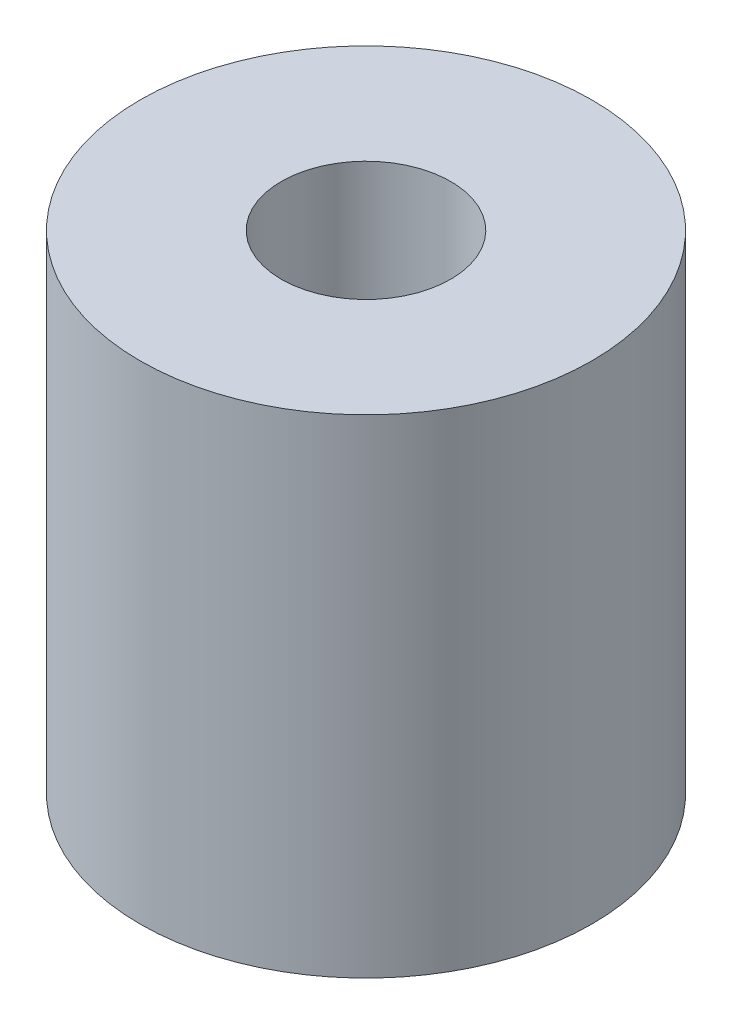
ISO-10303-21;
HEADER;
FILE_DESCRIPTION(('STEP AP214'),'2;1');
FILE_NAME('part.step','',(''),(''),'','','');
FILE_SCHEMA(('AUTOMOTIVE_DESIGN { 1 0 10303 214 1 1 1 1 }'));
ENDSEC;
DATA;
#1=APPLICATION_CONTEXT('core data for automotive mechanical design processes');
#2=APPLICATION_PROTOCOL_DEFINITION('international standard','automotive_design',2000,#1);
#3=PRODUCT_CONTEXT('',#1,'mechanical');
#4=PRODUCT('Part','Part','',(#3));
#5=PRODUCT_RELATED_PRODUCT_CATEGORY('part','',(#4));
#6=PRODUCT_DEFINITION_FORMATION('','',#4);
#7=PRODUCT_DEFINITION_CONTEXT('part definition',#1,'design');
#8=PRODUCT_DEFINITION('design','',#6,#7);
#9=PRODUCT_DEFINITION_SHAPE('','',#8);
#10=(LENGTH_UNIT() NAMED_UNIT(*) SI_UNIT(.MILLI.,.METRE.));
#11=(NAMED_UNIT(*) PLANE_ANGLE_UNIT() SI_UNIT($,.RADIAN.));
#12=(NAMED_UNIT(*) SI_UNIT($,.STERADIAN.) SOLID_ANGLE_UNIT());
#13=UNCERTAINTY_MEASURE_WITH_UNIT(LENGTH_MEASURE(1.E-05),#10,'distance_accuracy_value','');
#14=(GEOMETRIC_REPRESENTATION_CONTEXT(3) GLOBAL_UNCERTAINTY_ASSIGNED_CONTEXT((#13)) GLOBAL_UNIT_ASSIGNED_CONTEXT((#10,
#11,#12)) REPRESENTATION_CONTEXT('',''));
#15=CARTESIAN_POINT('',(0.,0.,0.));
#16=DIRECTION('',(0.,0.,1.));
#17=DIRECTION('',(1.,0.,0.));
#18=AXIS2_PLACEMENT_3D('',#15,#16,#17);
#19=CARTESIAN_POINT('',(0.,8.636,0.));
#20=DIRECTION('',(0.,-1.,0.));
#21=DIRECTION('',(0.,0.,-1.));
#22=AXIS2_PLACEMENT_3D('',#19,#20,#21);
#23=CYLINDRICAL_SURFACE('',#22,4.0000047);
#24=CARTESIAN_POINT('',(0.,8.636,0.));
#25=DIRECTION('',(0.,1.,0.));
#26=DIRECTION('',(0.,0.,1.));
#27=AXIS2_PLACEMENT_3D('',#24,#25,#26);
#28=CIRCLE('',#27,4.0000047);
#29=CARTESIAN_POINT('',(0.,8.636,4.0000047));
#30=VERTEX_POINT('',#29);
#31=EDGE_CURVE('E10',#30,#30,#28,.T.);
#32=ORIENTED_EDGE('',*,*,#31,.F.);
#33=EDGE_LOOP('',(#32));
#34=FACE_BOUND('',#33,.T.);
#35=CARTESIAN_POINT('',(0.,0.,0.));
#36=DIRECTION('',(0.,1.,0.));
#37=DIRECTION('',(0.,0.,1.));
#38=AXIS2_PLACEMENT_3D('',#35,#36,#37);
#39=CIRCLE('',#38,4.0000047);
#40=CARTESIAN_POINT('',(0.,0.,4.0000047));
#41=VERTEX_POINT('',#40);
#42=EDGE_CURVE('E34',#41,#41,#39,.T.);
#43=ORIENTED_EDGE('',*,*,#42,.T.);
#44=EDGE_LOOP('',(#43));
#45=FACE_BOUND('',#44,.T.);
#46=ADVANCED_FACE('F31',(#34,#45),#23,.T.);
#47=CARTESIAN_POINT('',(0.,8.636,0.));
#48=DIRECTION('',(0.,1.,0.));
#49=DIRECTION('',(0.,0.,1.));
#50=AXIS2_PLACEMENT_3D('',#47,#48,#49);
#51=PLANE('',#50);
#52=CARTESIAN_POINT('',(0.,8.636,0.));
#53=DIRECTION('',(0.,1.,0.));
#54=DIRECTION('',(0.,0.,1.));
#55=AXIS2_PLACEMENT_3D('',#52,#53,#54);
#56=CIRCLE('',#55,1.5);
#57=CARTESIAN_POINT('',(0.,8.636,1.5));
#58=VERTEX_POINT('',#57);
#59=EDGE_CURVE('E43',#58,#58,#56,.T.);
#60=ORIENTED_EDGE('',*,*,#59,.F.);
#61=EDGE_LOOP('',(#60));
#62=FACE_BOUND('',#61,.T.);
#63=ORIENTED_EDGE('',*,*,#31,.T.);
#64=EDGE_LOOP('',(#63));
#65=FACE_BOUND('',#64,.T.);
#66=ADVANCED_FACE('F58',(#62,#65),#51,.T.);
#67=CARTESIAN_POINT('',(0.,0.,0.));
#68=DIRECTION('',(0.,1.,0.));
#69=DIRECTION('',(0.,0.,1.));
#70=AXIS2_PLACEMENT_3D('',#67,#68,#69);
#71=PLANE('',#70);
#72=ORIENTED_EDGE('',*,*,#42,.F.);
#73=EDGE_LOOP('',(#72));
#74=FACE_BOUND('',#73,.T.);
#75=ADVANCED_FACE('F54',(#74),#71,.F.);
#76=CARTESIAN_POINT('',(0.,1.016,0.));
#77=DIRECTION('',(0.,1.,0.));
#78=DIRECTION('',(0.,0.,1.));
#79=AXIS2_PLACEMENT_3D('',#76,#77,#78);
#80=CYLINDRICAL_SURFACE('',#79,1.5);
#81=CARTESIAN_POINT('',(0.,1.016,0.));
#82=DIRECTION('',(0.,1.,0.));
#83=DIRECTION('',(0.,0.,1.));
#84=AXIS2_PLACEMENT_3D('',#81,#82,#83);
#85=CIRCLE('',#84,1.5);
#86=CARTESIAN_POINT('',(0.,1.016,1.5));
#87=VERTEX_POINT('',#86);
#88=EDGE_CURVE('E41',#87,#87,#85,.T.);
#89=CARTESIAN_POINT('',(0.,1.016,1.5));
#90=CARTESIAN_POINT('',(0.,1.095375,1.5));
#91=CARTESIAN_POINT('',(0.,1.17475,1.5));
#92=CARTESIAN_POINT('',(0.,1.3335,1.5));
#93=CARTESIAN_POINT('',(0.,1.412875,1.5));
#94=CARTESIAN_POINT('',(0.,1.571625,1.5));
#95=CARTESIAN_POINT('',(0.,1.651,1.5));
#96=CARTESIAN_POINT('',(0.,1.80975,1.5));
#97=CARTESIAN_POINT('',(0.,1.889125,1.5));
#98=CARTESIAN_POINT('',(0.,2.047875,1.5));
#99=CARTESIAN_POINT('',(0.,2.12725,1.5));
#100=CARTESIAN_POINT('',(0.,2.286,1.5));
#101=CARTESIAN_POINT('',(0.,2.365375,1.5));
#102=CARTESIAN_POINT('',(0.,2.524125,1.5));
#103=CARTESIAN_POINT('',(0.,2.6035,1.5));
#104=CARTESIAN_POINT('',(0.,2.76225,1.5));
#105=CARTESIAN_POINT('',(0.,2.841625,1.5));
#106=CARTESIAN_POINT('',(0.,3.000375,1.5));
#107=CARTESIAN_POINT('',(0.,3.07975,1.5));
#108=CARTESIAN_POINT('',(0.,3.2385,1.5));
#109=CARTESIAN_POINT('',(0.,3.317875,1.5));
#110=CARTESIAN_POINT('',(0.,3.476625,1.5));
#111=CARTESIAN_POINT('',(0.,3.556,1.5));
#112=CARTESIAN_POINT('',(0.,3.71475,1.5));
#113=CARTESIAN_POINT('',(0.,3.794125,1.5));
#114=CARTESIAN_POINT('',(0.,3.952875,1.5));
#115=CARTESIAN_POINT('',(0.,4.03225,1.5));
#116=CARTESIAN_POINT('',(0.,4.191,1.5));
#117=CARTESIAN_POINT('',(0.,4.270375,1.5));
#118=CARTESIAN_POINT('',(0.,4.429125,1.5));
#119=CARTESIAN_POINT('',(0.,4.5085,1.5));
#120=CARTESIAN_POINT('',(0.,4.66725,1.5));
#121=CARTESIAN_POINT('',(0.,4.746625,1.5));
#122=CARTESIAN_POINT('',(0.,4.905375,1.5));
#123=CARTESIAN_POINT('',(0.,4.98475,1.5));
#124=CARTESIAN_POINT('',(0.,5.1435,1.5));
#125=CARTESIAN_POINT('',(0.,5.222875,1.5));
#126=CARTESIAN_POINT('',(0.,5.381625,1.5));
#127=CARTESIAN_POINT('',(0.,5.461,1.5));
#128=CARTESIAN_POINT('',(0.,5.61975,1.5));
#129=CARTESIAN_POINT('',(0.,5.699125,1.5));
#130=CARTESIAN_POINT('',(0.,5.857875,1.5));
#131=CARTESIAN_POINT('',(0.,5.93725,1.5));
#132=CARTESIAN_POINT('',(0.,6.096,1.5));
#133=CARTESIAN_POINT('',(0.,6.175375,1.5));
#134=CARTESIAN_POINT('',(0.,6.334125,1.5));
#135=CARTESIAN_POINT('',(0.,6.4135,1.5));
#136=CARTESIAN_POINT('',(0.,6.57225,1.5));
#137=CARTESIAN_POINT('',(0.,6.651625,1.5));
#138=CARTESIAN_POINT('',(0.,6.810375,1.5));
#139=CARTESIAN_POINT('',(0.,6.88975,1.5));
#140=CARTESIAN_POINT('',(0.,7.0485,1.5));
#141=CARTESIAN_POINT('',(0.,7.127875,1.5));
#142=CARTESIAN_POINT('',(0.,7.286625,1.5));
#143=CARTESIAN_POINT('',(0.,7.366,1.5));
#144=CARTESIAN_POINT('',(0.,7.52475,1.5));
#145=CARTESIAN_POINT('',(0.,7.604125,1.5));
#146=CARTESIAN_POINT('',(0.,7.762875,1.5));
#147=CARTESIAN_POINT('',(0.,7.84225,1.5));
#148=CARTESIAN_POINT('',(0.,8.001,1.5));
#149=CARTESIAN_POINT('',(0.,8.080375,1.5));
#150=CARTESIAN_POINT('',(0.,8.239125,1.5));
#151=CARTESIAN_POINT('',(0.,8.3185,1.5));
#152=CARTESIAN_POINT('',(0.,8.47725,1.5));
#153=CARTESIAN_POINT('',(0.,8.556625,1.5));
#154=CARTESIAN_POINT('',(0.,8.636,1.5));
#155=B_SPLINE_CURVE_WITH_KNOTS('',3,(#89,#90,#91,#92,#93,#94,#95,#96,#97,#98,#99,#100,#101,#102,
#103,#104,#105,#106,#107,#108,#109,#110,#111,#112,#113,#114,#115,#116,#117,#118,#119,#120,#121,
#122,#123,#124,#125,#126,#127,#128,#129,#130,#131,#132,#133,#134,#135,#136,#137,#138,#139,#140,
#141,#142,#143,#144,#145,#146,#147,#148,#149,#150,#151,#152,#153,#154),.UNSPECIFIED.,.F.,.F.,(4,
2,2,2,2,2,2,2,2,2,2,2,2,2,2,2,2,2,2,2,2,2,2,2,2,2,2,2,2,2,2,2,4),(0.,0.238125,0.47625,0.714375,
0.9525,1.190625,1.42875,1.666875,1.905,2.143125,2.38125,2.619375,2.8575,3.095625,3.33375,
3.571875,3.81,4.048125,4.28625,4.524375,4.7625,5.000625,5.23875,5.476875,5.715,5.953125,6.19125,
6.429375,6.6675,6.905625,7.14375,7.381875,7.62),.UNSPECIFIED.);
#156=EDGE_CURVE('BSEAM51',#87,#58,#155,.T.);
#157=ORIENTED_EDGE('',*,*,#88,.F.);
#158=ORIENTED_EDGE('',*,*,#59,.T.);
#159=ORIENTED_EDGE('',*,*,#156,.T.);
#160=ORIENTED_EDGE('',*,*,#156,.F.);
#161=EDGE_LOOP('',(#157,#159,#158,#160));
#162=FACE_BOUND('',#161,.T.);
#163=ADVANCED_FACE('F51',(#162),#80,.F.);
#164=CARTESIAN_POINT('',(0.,1.016,0.));
#165=DIRECTION('',(0.,1.,0.));
#166=DIRECTION('',(0.,0.,1.));
#167=AXIS2_PLACEMENT_3D('',#164,#165,#166);
#168=PLANE('',#167);
#169=ORIENTED_EDGE('',*,*,#88,.T.);
#170=EDGE_LOOP('',(#169));
#171=FACE_BOUND('',#170,.T.);
#172=ADVANCED_FACE('F49',(#171),#168,.T.);
#173=CLOSED_SHELL('',(#46,#66,#75,#163,#172));
#174=MANIFOLD_SOLID_BREP('B2',#173);
#175=ADVANCED_BREP_SHAPE_REPRESENTATION('',(#18,#174),#14);
#176=SHAPE_DEFINITION_REPRESENTATION(#9,#175);
ENDSEC;
END-ISO-10303-21;
